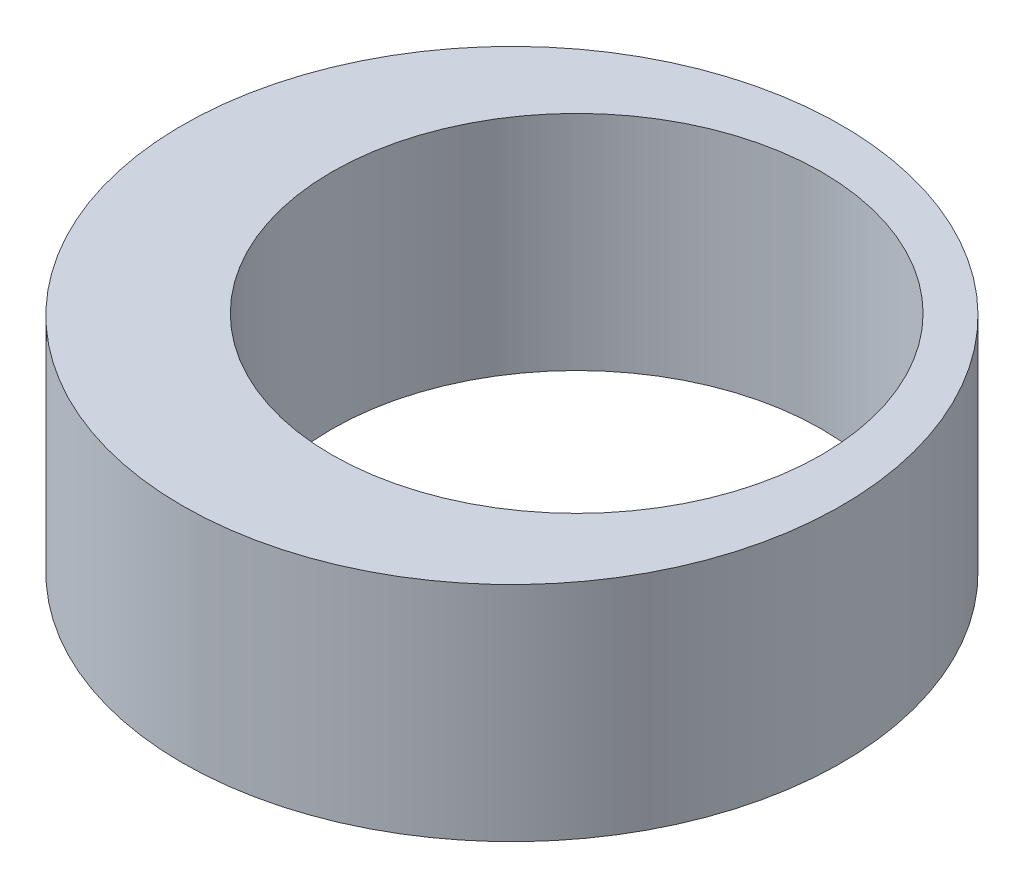
ISO-10303-21;
HEADER;
FILE_DESCRIPTION(('STEP AP214'),'2;1');
FILE_NAME('part.step','',(''),(''),'','','');
FILE_SCHEMA(('AUTOMOTIVE_DESIGN { 1 0 10303 214 1 1 1 1 }'));
ENDSEC;
DATA;
#1=APPLICATION_CONTEXT('core data for automotive mechanical design processes');
#2=APPLICATION_PROTOCOL_DEFINITION('international standard','automotive_design',2000,#1);
#3=PRODUCT_CONTEXT('',#1,'mechanical');
#4=PRODUCT('Part','Part','',(#3));
#5=PRODUCT_RELATED_PRODUCT_CATEGORY('part','',(#4));
#6=PRODUCT_DEFINITION_FORMATION('','',#4);
#7=PRODUCT_DEFINITION_CONTEXT('part definition',#1,'design');
#8=PRODUCT_DEFINITION('design','',#6,#7);
#9=PRODUCT_DEFINITION_SHAPE('','',#8);
#10=(LENGTH_UNIT() NAMED_UNIT(*) SI_UNIT(.MILLI.,.METRE.));
#11=(NAMED_UNIT(*) PLANE_ANGLE_UNIT() SI_UNIT($,.RADIAN.));
#12=(NAMED_UNIT(*) SI_UNIT($,.STERADIAN.) SOLID_ANGLE_UNIT());
#13=UNCERTAINTY_MEASURE_WITH_UNIT(LENGTH_MEASURE(1.E-05),#10,'distance_accuracy_value','');
#14=(GEOMETRIC_REPRESENTATION_CONTEXT(3) GLOBAL_UNCERTAINTY_ASSIGNED_CONTEXT((#13)) GLOBAL_UNIT_ASSIGNED_CONTEXT((#10,
#11,#12)) REPRESENTATION_CONTEXT('',''));
#15=CARTESIAN_POINT('',(0.,0.,0.));
#16=DIRECTION('',(0.,0.,1.));
#17=DIRECTION('',(1.,0.,0.));
#18=AXIS2_PLACEMENT_3D('',#15,#16,#17);
#19=CARTESIAN_POINT('',(0.,5.,0.));
#20=DIRECTION('',(0.,-1.,0.));
#21=DIRECTION('',(0.,0.,-1.));
#22=AXIS2_PLACEMENT_3D('',#19,#20,#21);
#23=CYLINDRICAL_SURFACE('',#22,7.4);
#24=CARTESIAN_POINT('',(0.,5.,0.));
#25=DIRECTION('',(0.,1.,0.));
#26=DIRECTION('',(0.,0.,1.));
#27=AXIS2_PLACEMENT_3D('',#24,#25,#26);
#28=CIRCLE('',#27,7.4);
#29=CARTESIAN_POINT('',(0.,5.,7.4));
#30=VERTEX_POINT('',#29);
#31=EDGE_CURVE('E10',#30,#30,#28,.T.);
#32=ORIENTED_EDGE('',*,*,#31,.F.);
#33=EDGE_LOOP('',(#32));
#34=FACE_BOUND('',#33,.T.);
#35=CARTESIAN_POINT('',(0.,0.,0.));
#36=DIRECTION('',(0.,1.,0.));
#37=DIRECTION('',(0.,0.,1.));
#38=AXIS2_PLACEMENT_3D('',#35,#36,#37);
#39=CIRCLE('',#38,7.4);
#40=CARTESIAN_POINT('',(0.,0.,7.4));
#41=VERTEX_POINT('',#40);
#42=EDGE_CURVE('E38',#41,#41,#39,.T.);
#43=ORIENTED_EDGE('',*,*,#42,.T.);
#44=EDGE_LOOP('',(#43));
#45=FACE_BOUND('',#44,.T.);
#46=ADVANCED_FACE('F35',(#34,#45),#23,.T.);
#47=CARTESIAN_POINT('',(0.,5.,0.));
#48=DIRECTION('',(0.,1.,0.));
#49=DIRECTION('',(0.,0.,1.));
#50=AXIS2_PLACEMENT_3D('',#47,#48,#49);
#51=PLANE('',#50);
#52=CARTESIAN_POINT('',(0.686398521139608,5.,-0.767689010643835));
#53=DIRECTION('',(0.,1.,0.));
#54=DIRECTION('',(0.,0.,1.));
#55=AXIS2_PLACEMENT_3D('',#52,#53,#54);
#56=CIRCLE('',#55,5.5);
#57=CARTESIAN_POINT('',(0.686398521139608,5.,4.73231098935617));
#58=VERTEX_POINT('',#57);
#59=EDGE_CURVE('E47',#58,#58,#56,.T.);
#60=ORIENTED_EDGE('',*,*,#59,.F.);
#61=EDGE_LOOP('',(#60));
#62=FACE_BOUND('',#61,.T.);
#63=ORIENTED_EDGE('',*,*,#31,.T.);
#64=EDGE_LOOP('',(#63));
#65=FACE_BOUND('',#64,.T.);
#66=ADVANCED_FACE('F62',(#62,#65),#51,.T.);
#67=CARTESIAN_POINT('',(0.,0.,0.));
#68=DIRECTION('',(0.,1.,0.));
#69=DIRECTION('',(0.,0.,1.));
#70=AXIS2_PLACEMENT_3D('',#67,#68,#69);
#71=PLANE('',#70);
#72=CARTESIAN_POINT('',(0.686398521139608,0.,-0.767689010643835));
#73=DIRECTION('',(0.,1.,0.));
#74=DIRECTION('',(0.,0.,1.));
#75=AXIS2_PLACEMENT_3D('',#72,#73,#74);
#76=CIRCLE('',#75,5.5);
#77=CARTESIAN_POINT('',(0.686398521139608,0.,4.73231098935617));
#78=VERTEX_POINT('',#77);
#79=EDGE_CURVE('E45',#78,#78,#76,.T.);
#80=ORIENTED_EDGE('',*,*,#79,.T.);
#81=EDGE_LOOP('',(#80));
#82=FACE_BOUND('',#81,.T.);
#83=ORIENTED_EDGE('',*,*,#42,.F.);
#84=EDGE_LOOP('',(#83));
#85=FACE_BOUND('',#84,.T.);
#86=ADVANCED_FACE('F53',(#82,#85),#71,.F.);
#87=CARTESIAN_POINT('',(0.686398521139608,0.,-0.767689010643835));
#88=DIRECTION('',(0.,1.,0.));
#89=DIRECTION('',(0.,0.,1.));
#90=AXIS2_PLACEMENT_3D('',#87,#88,#89);
#91=CYLINDRICAL_SURFACE('',#90,5.5);
#92=ORIENTED_EDGE('',*,*,#79,.F.);
#93=EDGE_LOOP('',(#92));
#94=FACE_BOUND('',#93,.T.);
#95=ORIENTED_EDGE('',*,*,#59,.T.);
#96=EDGE_LOOP('',(#95));
#97=FACE_BOUND('',#96,.T.);
#98=ADVANCED_FACE('F56',(#94,#97),#91,.F.);
#99=CLOSED_SHELL('',(#46,#66,#86,#98));
#100=MANIFOLD_SOLID_BREP('B2',#99);
#101=ADVANCED_BREP_SHAPE_REPRESENTATION('',(#18,#100),#14);
#102=SHAPE_DEFINITION_REPRESENTATION(#9,#101);
ENDSEC;
END-ISO-10303-21;
